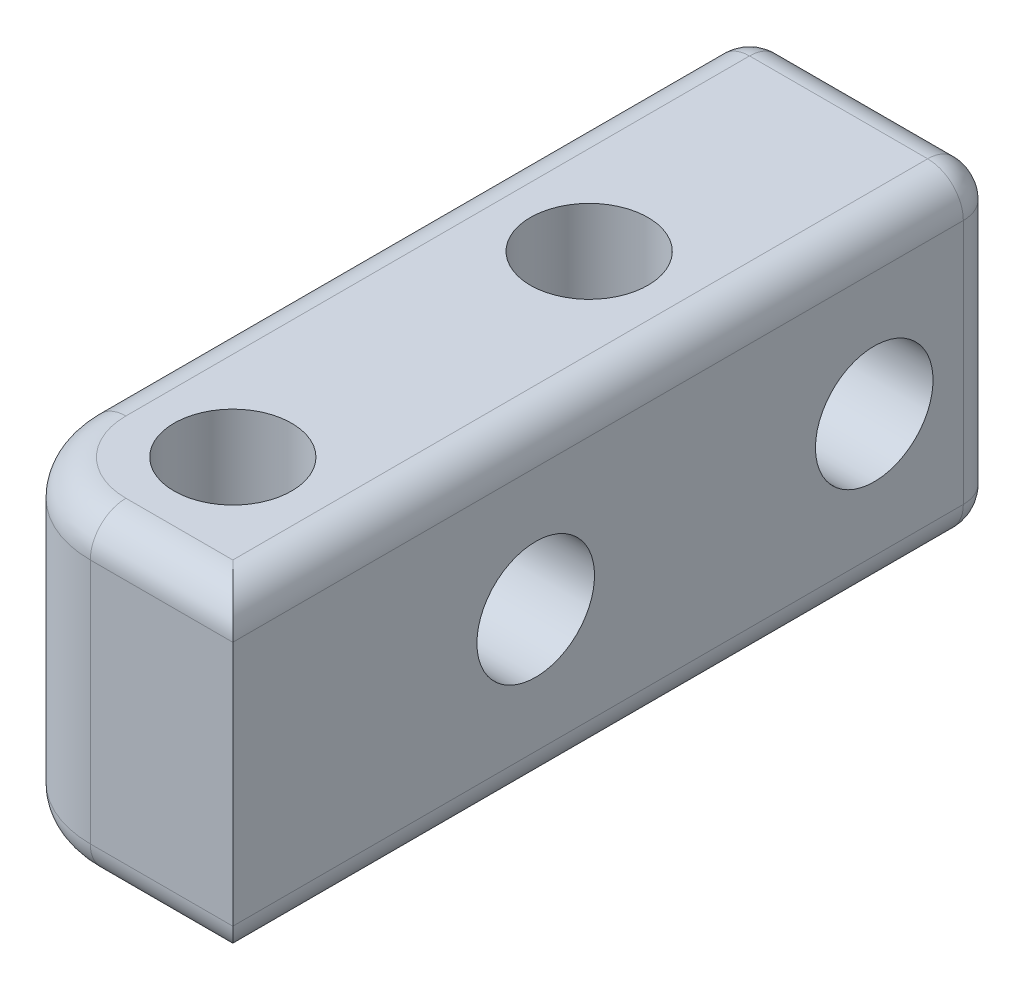
ISO-10303-21;
HEADER;
FILE_DESCRIPTION(('STEP AP214'),'2;1');
FILE_NAME('part.step','',(''),(''),'','','');
FILE_SCHEMA(('AUTOMOTIVE_DESIGN { 1 0 10303 214 1 1 1 1 }'));
ENDSEC;
DATA;
#1=APPLICATION_CONTEXT('core data for automotive mechanical design processes');
#2=APPLICATION_PROTOCOL_DEFINITION('international standard','automotive_design',2000,#1);
#3=PRODUCT_CONTEXT('',#1,'mechanical');
#4=PRODUCT('Part','Part','',(#3));
#5=PRODUCT_RELATED_PRODUCT_CATEGORY('part','',(#4));
#6=PRODUCT_DEFINITION_FORMATION('','',#4);
#7=PRODUCT_DEFINITION_CONTEXT('part definition',#1,'design');
#8=PRODUCT_DEFINITION('design','',#6,#7);
#9=PRODUCT_DEFINITION_SHAPE('','',#8);
#10=(LENGTH_UNIT() NAMED_UNIT(*) SI_UNIT(.MILLI.,.METRE.));
#11=(NAMED_UNIT(*) PLANE_ANGLE_UNIT() SI_UNIT($,.RADIAN.));
#12=(NAMED_UNIT(*) SI_UNIT($,.STERADIAN.) SOLID_ANGLE_UNIT());
#13=UNCERTAINTY_MEASURE_WITH_UNIT(LENGTH_MEASURE(1.E-05),#10,'distance_accuracy_value','');
#14=(GEOMETRIC_REPRESENTATION_CONTEXT(3) GLOBAL_UNCERTAINTY_ASSIGNED_CONTEXT((#13)) GLOBAL_UNIT_ASSIGNED_CONTEXT((#10,
#11,#12)) REPRESENTATION_CONTEXT('',''));
#15=CARTESIAN_POINT('',(0.,0.,0.));
#16=DIRECTION('',(0.,0.,1.));
#17=DIRECTION('',(1.,0.,0.));
#18=AXIS2_PLACEMENT_3D('',#15,#16,#17);
#19=CARTESIAN_POINT('',(0.,8.9,21.5));
#20=DIRECTION('',(0.,-1.,0.));
#21=DIRECTION('',(0.,0.,-1.));
#22=AXIS2_PLACEMENT_3D('',#19,#20,#21);
#23=PLANE('',#22);
#24=CARTESIAN_POINT('',(3.5,8.9,17.9999999999996));
#25=DIRECTION('',(0.,1.,0.));
#26=DIRECTION('',(0.,0.,1.));
#27=AXIS2_PLACEMENT_3D('',#24,#25,#26);
#28=CIRCLE('',#27,1.6499999999996);
#29=CARTESIAN_POINT('',(3.5,8.9,19.6499999999992));
#30=VERTEX_POINT('',#29);
#31=EDGE_CURVE('E258',#30,#30,#28,.T.);
#32=ORIENTED_EDGE('',*,*,#31,.F.);
#33=EDGE_LOOP('',(#32));
#34=FACE_BOUND('',#33,.T.);
#35=CARTESIAN_POINT('',(3.5,8.9,7.99999999999965));
#36=DIRECTION('',(0.,1.,0.));
#37=DIRECTION('',(0.,0.,1.));
#38=AXIS2_PLACEMENT_3D('',#35,#36,#37);
#39=CIRCLE('',#38,1.6499999999996);
#40=CARTESIAN_POINT('',(3.5,8.9,9.64999999999925));
#41=VERTEX_POINT('',#40);
#42=EDGE_CURVE('E263',#41,#41,#39,.T.);
#43=ORIENTED_EDGE('',*,*,#42,.F.);
#44=EDGE_LOOP('',(#43));
#45=FACE_BOUND('',#44,.T.);
#46=CARTESIAN_POINT('',(3.,8.9,18.5));
#47=DIRECTION('',(0.,-1.,0.));
#48=DIRECTION('',(0.,0.,-1.));
#49=AXIS2_PLACEMENT_3D('',#46,#47,#48);
#50=CIRCLE('',#49,2.);
#51=CARTESIAN_POINT('',(3.,8.9,20.5));
#52=VERTEX_POINT('',#51);
#53=CARTESIAN_POINT('',(1.,8.9,18.5));
#54=VERTEX_POINT('',#53);
#55=EDGE_CURVE('E248',#52,#54,#50,.T.);
#56=ORIENTED_EDGE('',*,*,#55,.F.);
#57=DIRECTION('',(-1.,0.,0.));
#58=VECTOR('',#57,1.);
#59=CARTESIAN_POINT('',(0.,8.9,20.5));
#60=LINE('',#59,#58);
#61=CARTESIAN_POINT('',(6.,8.9,20.5));
#62=VERTEX_POINT('',#61);
#63=EDGE_CURVE('E191',#52,#62,#60,.F.);
#64=ORIENTED_EDGE('',*,*,#63,.T.);
#65=DIRECTION('',(0.,0.,-1.));
#66=VECTOR('',#65,1.);
#67=CARTESIAN_POINT('',(6.,8.9,21.5));
#68=LINE('',#67,#66);
#69=CARTESIAN_POINT('',(6.,8.9,1.));
#70=VERTEX_POINT('',#69);
#71=EDGE_CURVE('E138',#62,#70,#68,.T.);
#72=ORIENTED_EDGE('',*,*,#71,.T.);
#73=DIRECTION('',(-1.,0.,0.));
#74=VECTOR('',#73,1.);
#75=CARTESIAN_POINT('',(0.,8.9,1.));
#76=LINE('',#75,#74);
#77=CARTESIAN_POINT('',(1.,8.9,1.));
#78=VERTEX_POINT('',#77);
#79=EDGE_CURVE('E186',#70,#78,#76,.T.);
#80=ORIENTED_EDGE('',*,*,#79,.T.);
#81=DIRECTION('',(0.,0.,-1.));
#82=VECTOR('',#81,1.);
#83=CARTESIAN_POINT('',(1.,8.9,21.5));
#84=LINE('',#83,#82);
#85=EDGE_CURVE('E188',#78,#54,#84,.F.);
#86=ORIENTED_EDGE('',*,*,#85,.T.);
#87=EDGE_LOOP('',(#56,#64,#72,#80,#86));
#88=FACE_BOUND('',#87,.T.);
#89=ADVANCED_FACE('F36',(#34,#45,#88),#23,.F.);
#90=CARTESIAN_POINT('',(0.,0.,21.5));
#91=DIRECTION('',(0.,1.,0.));
#92=DIRECTION('',(0.,0.,1.));
#93=AXIS2_PLACEMENT_3D('',#90,#91,#92);
#94=PLANE('',#93);
#95=CARTESIAN_POINT('',(3.5,0.,17.9999999999996));
#96=DIRECTION('',(0.,1.,0.));
#97=DIRECTION('',(0.,0.,1.));
#98=AXIS2_PLACEMENT_3D('',#95,#96,#97);
#99=CIRCLE('',#98,1.6499999999996);
#100=CARTESIAN_POINT('',(3.5,0.,19.6499999999992));
#101=VERTEX_POINT('',#100);
#102=EDGE_CURVE('E268',#101,#101,#99,.T.);
#103=ORIENTED_EDGE('',*,*,#102,.T.);
#104=EDGE_LOOP('',(#103));
#105=FACE_BOUND('',#104,.T.);
#106=CARTESIAN_POINT('',(3.5,0.,7.99999999999965));
#107=DIRECTION('',(0.,1.,0.));
#108=DIRECTION('',(0.,0.,1.));
#109=AXIS2_PLACEMENT_3D('',#106,#107,#108);
#110=CIRCLE('',#109,1.6499999999996);
#111=CARTESIAN_POINT('',(3.5,0.,9.64999999999925));
#112=VERTEX_POINT('',#111);
#113=EDGE_CURVE('E273',#112,#112,#110,.T.);
#114=ORIENTED_EDGE('',*,*,#113,.T.);
#115=EDGE_LOOP('',(#114));
#116=FACE_BOUND('',#115,.T.);
#117=CARTESIAN_POINT('',(3.,0.,18.5));
#118=DIRECTION('',(0.,1.,0.));
#119=DIRECTION('',(0.,0.,1.));
#120=AXIS2_PLACEMENT_3D('',#117,#118,#119);
#121=CIRCLE('',#120,2.);
#122=CARTESIAN_POINT('',(1.,0.,18.5));
#123=VERTEX_POINT('',#122);
#124=CARTESIAN_POINT('',(3.,0.,20.5));
#125=VERTEX_POINT('',#124);
#126=EDGE_CURVE('E203',#123,#125,#121,.T.);
#127=ORIENTED_EDGE('',*,*,#126,.F.);
#128=DIRECTION('',(0.,0.,-1.));
#129=VECTOR('',#128,1.);
#130=CARTESIAN_POINT('',(1.,0.,21.5));
#131=LINE('',#130,#129);
#132=CARTESIAN_POINT('',(1.,0.,1.));
#133=VERTEX_POINT('',#132);
#134=EDGE_CURVE('E201',#123,#133,#131,.T.);
#135=ORIENTED_EDGE('',*,*,#134,.T.);
#136=DIRECTION('',(1.,0.,0.));
#137=VECTOR('',#136,1.);
#138=CARTESIAN_POINT('',(7.,0.,1.));
#139=LINE('',#138,#137);
#140=CARTESIAN_POINT('',(6.,0.,1.));
#141=VERTEX_POINT('',#140);
#142=EDGE_CURVE('E196',#133,#141,#139,.T.);
#143=ORIENTED_EDGE('',*,*,#142,.T.);
#144=DIRECTION('',(0.,0.,-1.));
#145=VECTOR('',#144,1.);
#146=CARTESIAN_POINT('',(6.,0.,21.5));
#147=LINE('',#146,#145);
#148=CARTESIAN_POINT('',(6.,0.,20.5));
#149=VERTEX_POINT('',#148);
#150=EDGE_CURVE('E198',#141,#149,#147,.F.);
#151=ORIENTED_EDGE('',*,*,#150,.T.);
#152=DIRECTION('',(1.,0.,0.));
#153=VECTOR('',#152,1.);
#154=CARTESIAN_POINT('',(0.,0.,20.5));
#155=LINE('',#154,#153);
#156=EDGE_CURVE('E155',#149,#125,#155,.F.);
#157=ORIENTED_EDGE('',*,*,#156,.T.);
#158=EDGE_LOOP('',(#127,#135,#143,#151,#157));
#159=FACE_BOUND('',#158,.T.);
#160=ADVANCED_FACE('F287',(#105,#116,#159),#94,.F.);
#161=CARTESIAN_POINT('',(0.,0.,21.5));
#162=DIRECTION('',(1.,0.,0.));
#163=DIRECTION('',(0.,0.,-1.));
#164=AXIS2_PLACEMENT_3D('',#161,#162,#163);
#165=PLANE('',#164);
#166=CARTESIAN_POINT('',(0.,4.45,3.5));
#167=DIRECTION('',(-1.,0.,0.));
#168=DIRECTION('',(0.,0.,1.));
#169=AXIS2_PLACEMENT_3D('',#166,#167,#168);
#170=CIRCLE('',#169,1.65);
#171=CARTESIAN_POINT('',(0.,4.45,5.15));
#172=VERTEX_POINT('',#171);
#173=EDGE_CURVE('E239',#172,#172,#170,.T.);
#174=ORIENTED_EDGE('',*,*,#173,.F.);
#175=EDGE_LOOP('',(#174));
#176=FACE_BOUND('',#175,.T.);
#177=CARTESIAN_POINT('',(0.,4.45,13.));
#178=DIRECTION('',(-1.,0.,0.));
#179=DIRECTION('',(0.,0.,1.));
#180=AXIS2_PLACEMENT_3D('',#177,#178,#179);
#181=CIRCLE('',#180,1.65);
#182=CARTESIAN_POINT('',(0.,4.45,14.65));
#183=VERTEX_POINT('',#182);
#184=EDGE_CURVE('E276',#183,#183,#181,.T.);
#185=ORIENTED_EDGE('',*,*,#184,.F.);
#186=EDGE_LOOP('',(#185));
#187=FACE_BOUND('',#186,.T.);
#188=DIRECTION('',(0.,0.,-1.));
#189=VECTOR('',#188,1.);
#190=CARTESIAN_POINT('',(0.,1.,21.5));
#191=LINE('',#190,#189);
#192=CARTESIAN_POINT('',(0.,1.,1.));
#193=VERTEX_POINT('',#192);
#194=CARTESIAN_POINT('',(0.,1.,18.5));
#195=VERTEX_POINT('',#194);
#196=EDGE_CURVE('E180',#193,#195,#191,.F.);
#197=ORIENTED_EDGE('',*,*,#196,.T.);
#198=DIRECTION('',(0.,-1.,0.));
#199=VECTOR('',#198,1.);
#200=CARTESIAN_POINT('',(0.,0.,18.5));
#201=LINE('',#200,#199);
#202=CARTESIAN_POINT('',(0.,7.9,18.5));
#203=VERTEX_POINT('',#202);
#204=EDGE_CURVE('E11',#195,#203,#201,.F.);
#205=ORIENTED_EDGE('',*,*,#204,.T.);
#206=DIRECTION('',(0.,0.,-1.));
#207=VECTOR('',#206,1.);
#208=CARTESIAN_POINT('',(0.,7.9,21.5));
#209=LINE('',#208,#207);
#210=CARTESIAN_POINT('',(0.,7.9,1.));
#211=VERTEX_POINT('',#210);
#212=EDGE_CURVE('E184',#203,#211,#209,.T.);
#213=ORIENTED_EDGE('',*,*,#212,.T.);
#214=DIRECTION('',(0.,-1.,0.));
#215=VECTOR('',#214,1.);
#216=CARTESIAN_POINT('',(0.,0.,1.));
#217=LINE('',#216,#215);
#218=EDGE_CURVE('E182',#211,#193,#217,.T.);
#219=ORIENTED_EDGE('',*,*,#218,.T.);
#220=EDGE_LOOP('',(#197,#205,#213,#219));
#221=FACE_BOUND('',#220,.T.);
#222=ADVANCED_FACE('F284',(#176,#187,#221),#165,.F.);
#223=CARTESIAN_POINT('',(7.,0.,21.5));
#224=DIRECTION('',(-1.,0.,0.));
#225=DIRECTION('',(0.,0.,1.));
#226=AXIS2_PLACEMENT_3D('',#223,#224,#225);
#227=PLANE('',#226);
#228=CARTESIAN_POINT('',(7.,4.45,3.5));
#229=DIRECTION('',(-1.,0.,0.));
#230=DIRECTION('',(0.,0.,1.));
#231=AXIS2_PLACEMENT_3D('',#228,#229,#230);
#232=CIRCLE('',#231,1.65);
#233=CARTESIAN_POINT('',(7.,4.45,5.15));
#234=VERTEX_POINT('',#233);
#235=EDGE_CURVE('E207',#234,#234,#232,.T.);
#236=ORIENTED_EDGE('',*,*,#235,.T.);
#237=EDGE_LOOP('',(#236));
#238=FACE_BOUND('',#237,.T.);
#239=CARTESIAN_POINT('',(7.,4.45,13.));
#240=DIRECTION('',(-1.,0.,0.));
#241=DIRECTION('',(0.,0.,1.));
#242=AXIS2_PLACEMENT_3D('',#239,#240,#241);
#243=CIRCLE('',#242,1.65);
#244=CARTESIAN_POINT('',(7.,4.45,14.65));
#245=VERTEX_POINT('',#244);
#246=EDGE_CURVE('E236',#245,#245,#243,.T.);
#247=ORIENTED_EDGE('',*,*,#246,.T.);
#248=EDGE_LOOP('',(#247));
#249=FACE_BOUND('',#248,.T.);
#250=DIRECTION('',(0.,1.,0.));
#251=VECTOR('',#250,1.);
#252=CARTESIAN_POINT('',(7.,8.9,1.));
#253=LINE('',#252,#251);
#254=CARTESIAN_POINT('',(7.,1.,1.));
#255=VERTEX_POINT('',#254);
#256=CARTESIAN_POINT('',(7.,7.9,1.));
#257=VERTEX_POINT('',#256);
#258=EDGE_CURVE('E165',#255,#257,#253,.T.);
#259=ORIENTED_EDGE('',*,*,#258,.T.);
#260=DIRECTION('',(0.,0.,-1.));
#261=VECTOR('',#260,1.);
#262=CARTESIAN_POINT('',(7.,7.9,21.5));
#263=LINE('',#262,#261);
#264=CARTESIAN_POINT('',(7.,7.9,21.5));
#265=VERTEX_POINT('',#264);
#266=EDGE_CURVE('E147',#257,#265,#263,.F.);
#267=ORIENTED_EDGE('',*,*,#266,.T.);
#268=DIRECTION('',(0.,1.,0.));
#269=VECTOR('',#268,1.);
#270=CARTESIAN_POINT('',(7.,0.,21.5));
#271=LINE('',#270,#269);
#272=CARTESIAN_POINT('',(7.,1.,21.5));
#273=VERTEX_POINT('',#272);
#274=EDGE_CURVE('E132',#273,#265,#271,.T.);
#275=ORIENTED_EDGE('',*,*,#274,.F.);
#276=DIRECTION('',(0.,0.,-1.));
#277=VECTOR('',#276,1.);
#278=CARTESIAN_POINT('',(7.,1.,21.5));
#279=LINE('',#278,#277);
#280=EDGE_CURVE('E144',#273,#255,#279,.T.);
#281=ORIENTED_EDGE('',*,*,#280,.T.);
#282=EDGE_LOOP('',(#259,#267,#275,#281));
#283=FACE_BOUND('',#282,.T.);
#284=ADVANCED_FACE('F142',(#238,#249,#283),#227,.F.);
#285=CARTESIAN_POINT('',(0.,0.,21.5));
#286=DIRECTION('',(0.,0.,-1.));
#287=DIRECTION('',(-1.,0.,0.));
#288=AXIS2_PLACEMENT_3D('',#285,#286,#287);
#289=PLANE('',#288);
#290=DIRECTION('',(-1.,0.,0.));
#291=VECTOR('',#290,1.);
#292=CARTESIAN_POINT('',(0.,7.9,21.5));
#293=LINE('',#292,#291);
#294=CARTESIAN_POINT('',(3.,7.9,21.5));
#295=VERTEX_POINT('',#294);
#296=EDGE_CURVE('E137',#265,#295,#293,.T.);
#297=ORIENTED_EDGE('',*,*,#296,.T.);
#298=DIRECTION('',(0.,-1.,0.));
#299=VECTOR('',#298,1.);
#300=CARTESIAN_POINT('',(3.,0.,21.5));
#301=LINE('',#300,#299);
#302=CARTESIAN_POINT('',(3.,1.,21.5));
#303=VERTEX_POINT('',#302);
#304=EDGE_CURVE('E45',#295,#303,#301,.T.);
#305=ORIENTED_EDGE('',*,*,#304,.T.);
#306=DIRECTION('',(1.,0.,0.));
#307=VECTOR('',#306,1.);
#308=CARTESIAN_POINT('',(0.,1.,21.5));
#309=LINE('',#308,#307);
#310=EDGE_CURVE('E129',#303,#273,#309,.T.);
#311=ORIENTED_EDGE('',*,*,#310,.T.);
#312=ORIENTED_EDGE('',*,*,#274,.T.);
#313=EDGE_LOOP('',(#297,#305,#311,#312));
#314=FACE_BOUND('',#313,.T.);
#315=ADVANCED_FACE('F131',(#314),#289,.F.);
#316=CARTESIAN_POINT('',(0.,0.,0.));
#317=DIRECTION('',(0.,0.,-1.));
#318=DIRECTION('',(-1.,0.,0.));
#319=AXIS2_PLACEMENT_3D('',#316,#317,#318);
#320=PLANE('',#319);
#321=DIRECTION('',(0.,-1.,0.));
#322=VECTOR('',#321,1.);
#323=CARTESIAN_POINT('',(1.,8.9,0.));
#324=LINE('',#323,#322);
#325=CARTESIAN_POINT('',(1.,1.,0.));
#326=VERTEX_POINT('',#325);
#327=CARTESIAN_POINT('',(1.,7.9,0.));
#328=VERTEX_POINT('',#327);
#329=EDGE_CURVE('E173',#326,#328,#324,.F.);
#330=ORIENTED_EDGE('',*,*,#329,.T.);
#331=DIRECTION('',(-1.,0.,0.));
#332=VECTOR('',#331,1.);
#333=CARTESIAN_POINT('',(7.,7.9,0.));
#334=LINE('',#333,#332);
#335=CARTESIAN_POINT('',(6.,7.9,0.));
#336=VERTEX_POINT('',#335);
#337=EDGE_CURVE('E178',#328,#336,#334,.F.);
#338=ORIENTED_EDGE('',*,*,#337,.T.);
#339=DIRECTION('',(0.,1.,0.));
#340=VECTOR('',#339,1.);
#341=CARTESIAN_POINT('',(6.,0.,0.));
#342=LINE('',#341,#340);
#343=CARTESIAN_POINT('',(6.,1.,0.));
#344=VERTEX_POINT('',#343);
#345=EDGE_CURVE('E175',#336,#344,#342,.F.);
#346=ORIENTED_EDGE('',*,*,#345,.T.);
#347=DIRECTION('',(1.,0.,0.));
#348=VECTOR('',#347,1.);
#349=CARTESIAN_POINT('',(0.,1.,0.));
#350=LINE('',#349,#348);
#351=EDGE_CURVE('E171',#344,#326,#350,.F.);
#352=ORIENTED_EDGE('',*,*,#351,.T.);
#353=EDGE_LOOP('',(#330,#338,#346,#352));
#354=FACE_BOUND('',#353,.T.);
#355=ADVANCED_FACE('F342',(#354),#320,.T.);
#356=CARTESIAN_POINT('',(1.,1.,21.5));
#357=DIRECTION('',(0.,0.,-1.));
#358=DIRECTION('',(-1.,0.,0.));
#359=AXIS2_PLACEMENT_3D('',#356,#357,#358);
#360=CYLINDRICAL_SURFACE('',#359,1.);
#361=ORIENTED_EDGE('',*,*,#134,.F.);
#362=CARTESIAN_POINT('',(1.,1.,18.5));
#363=DIRECTION('',(0.,0.,-1.));
#364=DIRECTION('',(-1.,0.,0.));
#365=AXIS2_PLACEMENT_3D('',#362,#363,#364);
#366=CIRCLE('',#365,1.);
#367=EDGE_CURVE('E53',#123,#195,#366,.T.);
#368=ORIENTED_EDGE('',*,*,#367,.T.);
#369=ORIENTED_EDGE('',*,*,#196,.F.);
#370=CARTESIAN_POINT('',(1.,1.,1.));
#371=DIRECTION('',(0.,0.,-1.));
#372=DIRECTION('',(-1.,0.,0.));
#373=AXIS2_PLACEMENT_3D('',#370,#371,#372);
#374=CIRCLE('',#373,1.);
#375=EDGE_CURVE('E231',#133,#193,#374,.T.);
#376=ORIENTED_EDGE('',*,*,#375,.F.);
#377=EDGE_LOOP('',(#361,#368,#369,#376));
#378=FACE_BOUND('',#377,.T.);
#379=ADVANCED_FACE('F340',(#378),#360,.T.);
#380=CARTESIAN_POINT('',(1.,7.9,21.5));
#381=DIRECTION('',(0.,0.,-1.));
#382=DIRECTION('',(-1.,0.,0.));
#383=AXIS2_PLACEMENT_3D('',#380,#381,#382);
#384=CYLINDRICAL_SURFACE('',#383,1.);
#385=ORIENTED_EDGE('',*,*,#212,.F.);
#386=CARTESIAN_POINT('',(1.,7.9,18.5));
#387=DIRECTION('',(0.,0.,-1.));
#388=DIRECTION('',(-1.,0.,0.));
#389=AXIS2_PLACEMENT_3D('',#386,#387,#388);
#390=CIRCLE('',#389,1.);
#391=EDGE_CURVE('E246',#203,#54,#390,.T.);
#392=ORIENTED_EDGE('',*,*,#391,.T.);
#393=ORIENTED_EDGE('',*,*,#85,.F.);
#394=CARTESIAN_POINT('',(1.,7.9,1.));
#395=DIRECTION('',(0.,0.,-1.));
#396=DIRECTION('',(-1.,0.,0.));
#397=AXIS2_PLACEMENT_3D('',#394,#395,#396);
#398=CIRCLE('',#397,1.);
#399=EDGE_CURVE('E228',#211,#78,#398,.T.);
#400=ORIENTED_EDGE('',*,*,#399,.F.);
#401=EDGE_LOOP('',(#385,#392,#393,#400));
#402=FACE_BOUND('',#401,.T.);
#403=ADVANCED_FACE('F325',(#402),#384,.T.);
#404=CARTESIAN_POINT('',(1.,0.,1.));
#405=DIRECTION('',(0.,1.,0.));
#406=DIRECTION('',(0.,0.,1.));
#407=AXIS2_PLACEMENT_3D('',#404,#405,#406);
#408=CYLINDRICAL_SURFACE('',#407,1.);
#409=CARTESIAN_POINT('',(1.,1.,1.));
#410=DIRECTION('',(0.,-1.,0.));
#411=DIRECTION('',(0.,0.,-1.));
#412=AXIS2_PLACEMENT_3D('',#409,#410,#411);
#413=CIRCLE('',#412,1.);
#414=EDGE_CURVE('E148',#193,#326,#413,.T.);
#415=ORIENTED_EDGE('',*,*,#414,.F.);
#416=ORIENTED_EDGE('',*,*,#218,.F.);
#417=CARTESIAN_POINT('',(1.,7.9,1.));
#418=DIRECTION('',(0.,1.,0.));
#419=DIRECTION('',(0.,0.,1.));
#420=AXIS2_PLACEMENT_3D('',#417,#418,#419);
#421=CIRCLE('',#420,1.);
#422=EDGE_CURVE('E225',#328,#211,#421,.T.);
#423=ORIENTED_EDGE('',*,*,#422,.F.);
#424=ORIENTED_EDGE('',*,*,#329,.F.);
#425=EDGE_LOOP('',(#415,#416,#423,#424));
#426=FACE_BOUND('',#425,.T.);
#427=ADVANCED_FACE('F337',(#426),#408,.T.);
#428=CARTESIAN_POINT('',(1.,1.,1.));
#429=DIRECTION('',(0.,0.,1.));
#430=DIRECTION('',(1.,0.,0.));
#431=AXIS2_PLACEMENT_3D('',#428,#429,#430);
#432=SPHERICAL_SURFACE('',#431,1.);
#433=ORIENTED_EDGE('',*,*,#375,.T.);
#434=ORIENTED_EDGE('',*,*,#414,.T.);
#435=CARTESIAN_POINT('',(1.,1.,1.));
#436=DIRECTION('',(-1.,0.,0.));
#437=DIRECTION('',(0.,0.,1.));
#438=AXIS2_PLACEMENT_3D('',#435,#436,#437);
#439=CIRCLE('',#438,1.);
#440=EDGE_CURVE('E158',#133,#326,#439,.F.);
#441=ORIENTED_EDGE('',*,*,#440,.F.);
#442=EDGE_LOOP('',(#433,#434,#441));
#443=FACE_BOUND('',#442,.T.);
#444=ADVANCED_FACE('F339',(#443),#432,.T.);
#445=CARTESIAN_POINT('',(0.,1.,20.5));
#446=DIRECTION('',(1.,0.,0.));
#447=DIRECTION('',(0.,0.,-1.));
#448=AXIS2_PLACEMENT_3D('',#445,#446,#447);
#449=CYLINDRICAL_SURFACE('',#448,1.);
#450=ORIENTED_EDGE('',*,*,#310,.F.);
#451=CARTESIAN_POINT('',(3.,1.,20.5));
#452=DIRECTION('',(1.,0.,0.));
#453=DIRECTION('',(0.,0.,-1.));
#454=AXIS2_PLACEMENT_3D('',#451,#452,#453);
#455=CIRCLE('',#454,1.);
#456=EDGE_CURVE('E244',#303,#125,#455,.T.);
#457=ORIENTED_EDGE('',*,*,#456,.T.);
#458=ORIENTED_EDGE('',*,*,#156,.F.);
#459=CARTESIAN_POINT('',(6.,1.,20.5));
#460=DIRECTION('',(0.707106781186547,0.,-0.707106781186547));
#461=DIRECTION('',(-0.707106781186547,0.,-0.707106781186547));
#462=AXIS2_PLACEMENT_3D('',#459,#460,#461);
#463=ELLIPSE('',#462,1.41421356237309,1.);
#464=EDGE_CURVE('E152',#273,#149,#463,.T.);
#465=ORIENTED_EDGE('',*,*,#464,.F.);
#466=EDGE_LOOP('',(#450,#457,#458,#465));
#467=FACE_BOUND('',#466,.T.);
#468=ADVANCED_FACE('F153',(#467),#449,.T.);
#469=CARTESIAN_POINT('',(0.,7.9,20.5));
#470=DIRECTION('',(-1.,0.,0.));
#471=DIRECTION('',(0.,0.,1.));
#472=AXIS2_PLACEMENT_3D('',#469,#470,#471);
#473=CYLINDRICAL_SURFACE('',#472,1.);
#474=ORIENTED_EDGE('',*,*,#63,.F.);
#475=CARTESIAN_POINT('',(3.,7.9,20.5));
#476=DIRECTION('',(1.,0.,0.));
#477=DIRECTION('',(0.,0.,-1.));
#478=AXIS2_PLACEMENT_3D('',#475,#476,#477);
#479=CIRCLE('',#478,1.);
#480=EDGE_CURVE('E61',#52,#295,#479,.T.);
#481=ORIENTED_EDGE('',*,*,#480,.T.);
#482=ORIENTED_EDGE('',*,*,#296,.F.);
#483=CARTESIAN_POINT('',(6.,7.9,20.5));
#484=DIRECTION('',(-0.707106781186547,0.,0.707106781186547));
#485=DIRECTION('',(-0.707106781186547,0.,-0.707106781186547));
#486=AXIS2_PLACEMENT_3D('',#483,#484,#485);
#487=ELLIPSE('',#486,1.41421356237309,1.);
#488=EDGE_CURVE('E159',#62,#265,#487,.F.);
#489=ORIENTED_EDGE('',*,*,#488,.F.);
#490=EDGE_LOOP('',(#474,#481,#482,#489));
#491=FACE_BOUND('',#490,.T.);
#492=ADVANCED_FACE('F320',(#491),#473,.T.);
#493=CARTESIAN_POINT('',(1.,7.9,1.));
#494=DIRECTION('',(0.,0.,1.));
#495=DIRECTION('',(1.,0.,0.));
#496=AXIS2_PLACEMENT_3D('',#493,#494,#495);
#497=SPHERICAL_SURFACE('',#496,1.);
#498=ORIENTED_EDGE('',*,*,#422,.T.);
#499=ORIENTED_EDGE('',*,*,#399,.T.);
#500=CARTESIAN_POINT('',(1.,7.9,1.));
#501=DIRECTION('',(-1.,0.,0.));
#502=DIRECTION('',(0.,0.,1.));
#503=AXIS2_PLACEMENT_3D('',#500,#501,#502);
#504=CIRCLE('',#503,1.);
#505=EDGE_CURVE('E218',#328,#78,#504,.F.);
#506=ORIENTED_EDGE('',*,*,#505,.F.);
#507=EDGE_LOOP('',(#498,#499,#506));
#508=FACE_BOUND('',#507,.T.);
#509=ADVANCED_FACE('F333',(#508),#497,.T.);
#510=CARTESIAN_POINT('',(0.,1.,1.));
#511=DIRECTION('',(-1.,0.,0.));
#512=DIRECTION('',(0.,0.,1.));
#513=AXIS2_PLACEMENT_3D('',#510,#511,#512);
#514=CYLINDRICAL_SURFACE('',#513,1.);
#515=ORIENTED_EDGE('',*,*,#440,.T.);
#516=ORIENTED_EDGE('',*,*,#351,.F.);
#517=CARTESIAN_POINT('',(6.,1.,1.));
#518=DIRECTION('',(1.,0.,0.));
#519=DIRECTION('',(0.,0.,-1.));
#520=AXIS2_PLACEMENT_3D('',#517,#518,#519);
#521=CIRCLE('',#520,1.);
#522=EDGE_CURVE('E215',#141,#344,#521,.T.);
#523=ORIENTED_EDGE('',*,*,#522,.F.);
#524=ORIENTED_EDGE('',*,*,#142,.F.);
#525=EDGE_LOOP('',(#515,#516,#523,#524));
#526=FACE_BOUND('',#525,.T.);
#527=ADVANCED_FACE('F302',(#526),#514,.T.);
#528=CARTESIAN_POINT('',(6.,1.,21.5));
#529=DIRECTION('',(0.,0.,-1.));
#530=DIRECTION('',(-1.,0.,0.));
#531=AXIS2_PLACEMENT_3D('',#528,#529,#530);
#532=CYLINDRICAL_SURFACE('',#531,1.);
#533=ORIENTED_EDGE('',*,*,#464,.T.);
#534=ORIENTED_EDGE('',*,*,#150,.F.);
#535=CARTESIAN_POINT('',(6.,1.,1.));
#536=DIRECTION('',(0.,0.,-1.));
#537=DIRECTION('',(-1.,0.,0.));
#538=AXIS2_PLACEMENT_3D('',#535,#536,#537);
#539=CIRCLE('',#538,1.);
#540=EDGE_CURVE('E163',#255,#141,#539,.T.);
#541=ORIENTED_EDGE('',*,*,#540,.F.);
#542=ORIENTED_EDGE('',*,*,#280,.F.);
#543=EDGE_LOOP('',(#533,#534,#541,#542));
#544=FACE_BOUND('',#543,.T.);
#545=ADVANCED_FACE('F161',(#544),#532,.T.);
#546=CARTESIAN_POINT('',(6.,7.9,21.5));
#547=DIRECTION('',(0.,0.,-1.));
#548=DIRECTION('',(-1.,0.,0.));
#549=AXIS2_PLACEMENT_3D('',#546,#547,#548);
#550=CYLINDRICAL_SURFACE('',#549,1.);
#551=ORIENTED_EDGE('',*,*,#488,.T.);
#552=ORIENTED_EDGE('',*,*,#266,.F.);
#553=CARTESIAN_POINT('',(6.,7.9,1.));
#554=DIRECTION('',(0.,0.,-1.));
#555=DIRECTION('',(-1.,0.,0.));
#556=AXIS2_PLACEMENT_3D('',#553,#554,#555);
#557=CIRCLE('',#556,1.);
#558=EDGE_CURVE('E211',#70,#257,#557,.T.);
#559=ORIENTED_EDGE('',*,*,#558,.F.);
#560=ORIENTED_EDGE('',*,*,#71,.F.);
#561=EDGE_LOOP('',(#551,#552,#559,#560));
#562=FACE_BOUND('',#561,.T.);
#563=ADVANCED_FACE('F318',(#562),#550,.T.);
#564=CARTESIAN_POINT('',(0.,7.9,1.));
#565=DIRECTION('',(1.,0.,0.));
#566=DIRECTION('',(0.,0.,-1.));
#567=AXIS2_PLACEMENT_3D('',#564,#565,#566);
#568=CYLINDRICAL_SURFACE('',#567,1.);
#569=ORIENTED_EDGE('',*,*,#505,.T.);
#570=ORIENTED_EDGE('',*,*,#79,.F.);
#571=CARTESIAN_POINT('',(6.,7.9,1.));
#572=DIRECTION('',(1.,0.,0.));
#573=DIRECTION('',(0.,0.,-1.));
#574=AXIS2_PLACEMENT_3D('',#571,#572,#573);
#575=CIRCLE('',#574,1.);
#576=EDGE_CURVE('E209',#336,#70,#575,.T.);
#577=ORIENTED_EDGE('',*,*,#576,.F.);
#578=ORIENTED_EDGE('',*,*,#337,.F.);
#579=EDGE_LOOP('',(#569,#570,#577,#578));
#580=FACE_BOUND('',#579,.T.);
#581=ADVANCED_FACE('F329',(#580),#568,.T.);
#582=CARTESIAN_POINT('',(6.,1.,1.));
#583=DIRECTION('',(0.,0.,1.));
#584=DIRECTION('',(1.,0.,0.));
#585=AXIS2_PLACEMENT_3D('',#582,#583,#584);
#586=SPHERICAL_SURFACE('',#585,1.);
#587=ORIENTED_EDGE('',*,*,#540,.T.);
#588=ORIENTED_EDGE('',*,*,#522,.T.);
#589=CARTESIAN_POINT('',(6.,1.,1.));
#590=DIRECTION('',(0.,-1.,0.));
#591=DIRECTION('',(0.,0.,-1.));
#592=AXIS2_PLACEMENT_3D('',#589,#590,#591);
#593=CIRCLE('',#592,1.);
#594=EDGE_CURVE('E206',#255,#344,#593,.F.);
#595=ORIENTED_EDGE('',*,*,#594,.F.);
#596=EDGE_LOOP('',(#587,#588,#595));
#597=FACE_BOUND('',#596,.T.);
#598=ADVANCED_FACE('F305',(#597),#586,.T.);
#599=CARTESIAN_POINT('',(6.,7.9,1.));
#600=DIRECTION('',(0.,0.,1.));
#601=DIRECTION('',(1.,0.,0.));
#602=AXIS2_PLACEMENT_3D('',#599,#600,#601);
#603=SPHERICAL_SURFACE('',#602,1.);
#604=ORIENTED_EDGE('',*,*,#576,.T.);
#605=ORIENTED_EDGE('',*,*,#558,.T.);
#606=CARTESIAN_POINT('',(6.,7.9,1.));
#607=DIRECTION('',(0.,1.,0.));
#608=DIRECTION('',(0.,0.,1.));
#609=AXIS2_PLACEMENT_3D('',#606,#607,#608);
#610=CIRCLE('',#609,1.);
#611=EDGE_CURVE('E204',#336,#257,#610,.F.);
#612=ORIENTED_EDGE('',*,*,#611,.F.);
#613=EDGE_LOOP('',(#604,#605,#612));
#614=FACE_BOUND('',#613,.T.);
#615=ADVANCED_FACE('F313',(#614),#603,.T.);
#616=CARTESIAN_POINT('',(6.,0.,1.));
#617=DIRECTION('',(0.,-1.,0.));
#618=DIRECTION('',(0.,0.,-1.));
#619=AXIS2_PLACEMENT_3D('',#616,#617,#618);
#620=CYLINDRICAL_SURFACE('',#619,1.);
#621=ORIENTED_EDGE('',*,*,#594,.T.);
#622=ORIENTED_EDGE('',*,*,#345,.F.);
#623=ORIENTED_EDGE('',*,*,#611,.T.);
#624=ORIENTED_EDGE('',*,*,#258,.F.);
#625=EDGE_LOOP('',(#621,#622,#623,#624));
#626=FACE_BOUND('',#625,.T.);
#627=ADVANCED_FACE('F309',(#626),#620,.T.);
#628=CARTESIAN_POINT('',(10.,4.45,13.));
#629=DIRECTION('',(-1.,0.,0.));
#630=DIRECTION('',(0.,0.,1.));
#631=AXIS2_PLACEMENT_3D('',#628,#629,#630);
#632=CYLINDRICAL_SURFACE('',#631,1.65);
#633=ORIENTED_EDGE('',*,*,#184,.T.);
#634=EDGE_LOOP('',(#633));
#635=FACE_BOUND('',#634,.T.);
#636=ORIENTED_EDGE('',*,*,#246,.F.);
#637=EDGE_LOOP('',(#636));
#638=FACE_BOUND('',#637,.T.);
#639=ADVANCED_FACE('F281',(#635,#638),#632,.F.);
#640=CARTESIAN_POINT('',(10.,4.45,3.5));
#641=DIRECTION('',(-1.,0.,0.));
#642=DIRECTION('',(0.,0.,1.));
#643=AXIS2_PLACEMENT_3D('',#640,#641,#642);
#644=CYLINDRICAL_SURFACE('',#643,1.65);
#645=ORIENTED_EDGE('',*,*,#173,.T.);
#646=EDGE_LOOP('',(#645));
#647=FACE_BOUND('',#646,.T.);
#648=ORIENTED_EDGE('',*,*,#235,.F.);
#649=EDGE_LOOP('',(#648));
#650=FACE_BOUND('',#649,.T.);
#651=ADVANCED_FACE('F446',(#647,#650),#644,.F.);
#652=CARTESIAN_POINT('',(3.5,-1.1,17.9999999999996));
#653=DIRECTION('',(0.,1.,0.));
#654=DIRECTION('',(0.,0.,1.));
#655=AXIS2_PLACEMENT_3D('',#652,#653,#654);
#656=CYLINDRICAL_SURFACE('',#655,1.6499999999996);
#657=ORIENTED_EDGE('',*,*,#31,.T.);
#658=EDGE_LOOP('',(#657));
#659=FACE_BOUND('',#658,.T.);
#660=ORIENTED_EDGE('',*,*,#102,.F.);
#661=EDGE_LOOP('',(#660));
#662=FACE_BOUND('',#661,.T.);
#663=ADVANCED_FACE('F453',(#659,#662),#656,.F.);
#664=CARTESIAN_POINT('',(3.5,-1.1,7.99999999999965));
#665=DIRECTION('',(0.,1.,0.));
#666=DIRECTION('',(0.,0.,1.));
#667=AXIS2_PLACEMENT_3D('',#664,#665,#666);
#668=CYLINDRICAL_SURFACE('',#667,1.6499999999996);
#669=ORIENTED_EDGE('',*,*,#42,.T.);
#670=EDGE_LOOP('',(#669));
#671=FACE_BOUND('',#670,.T.);
#672=ORIENTED_EDGE('',*,*,#113,.F.);
#673=EDGE_LOOP('',(#672));
#674=FACE_BOUND('',#673,.T.);
#675=ADVANCED_FACE('F461',(#671,#674),#668,.F.);
#676=CARTESIAN_POINT('',(3.,7.9,18.5));
#677=DIRECTION('',(0.,-1.,0.));
#678=DIRECTION('',(0.,0.,-1.));
#679=AXIS2_PLACEMENT_3D('',#676,#677,#678);
#680=TOROIDAL_SURFACE('',#679,2.,1.);
#681=ORIENTED_EDGE('',*,*,#55,.T.);
#682=ORIENTED_EDGE('',*,*,#391,.F.);
#683=CARTESIAN_POINT('',(3.,7.9,18.5));
#684=DIRECTION('',(0.,-1.,0.));
#685=DIRECTION('',(0.,0.,-1.));
#686=AXIS2_PLACEMENT_3D('',#683,#684,#685);
#687=CIRCLE('',#686,3.);
#688=EDGE_CURVE('E40',#295,#203,#687,.T.);
#689=ORIENTED_EDGE('',*,*,#688,.F.);
#690=ORIENTED_EDGE('',*,*,#480,.F.);
#691=EDGE_LOOP('',(#681,#682,#689,#690));
#692=FACE_BOUND('',#691,.T.);
#693=ADVANCED_FACE('F38',(#692),#680,.T.);
#694=CARTESIAN_POINT('',(3.,0.,18.5));
#695=DIRECTION('',(0.,-1.,0.));
#696=DIRECTION('',(0.,0.,-1.));
#697=AXIS2_PLACEMENT_3D('',#694,#695,#696);
#698=CYLINDRICAL_SURFACE('',#697,3.);
#699=ORIENTED_EDGE('',*,*,#688,.T.);
#700=ORIENTED_EDGE('',*,*,#204,.F.);
#701=CARTESIAN_POINT('',(3.,1.,18.5));
#702=DIRECTION('',(0.,1.,0.));
#703=DIRECTION('',(0.,0.,1.));
#704=AXIS2_PLACEMENT_3D('',#701,#702,#703);
#705=CIRCLE('',#704,3.);
#706=EDGE_CURVE('E253',#303,#195,#705,.F.);
#707=ORIENTED_EDGE('',*,*,#706,.F.);
#708=ORIENTED_EDGE('',*,*,#304,.F.);
#709=EDGE_LOOP('',(#699,#700,#707,#708));
#710=FACE_BOUND('',#709,.T.);
#711=ADVANCED_FACE('F294',(#710),#698,.T.);
#712=CARTESIAN_POINT('',(3.,1.,18.5));
#713=DIRECTION('',(0.,1.,0.));
#714=DIRECTION('',(0.,0.,1.));
#715=AXIS2_PLACEMENT_3D('',#712,#713,#714);
#716=TOROIDAL_SURFACE('',#715,2.,1.);
#717=ORIENTED_EDGE('',*,*,#367,.F.);
#718=ORIENTED_EDGE('',*,*,#126,.T.);
#719=ORIENTED_EDGE('',*,*,#456,.F.);
#720=ORIENTED_EDGE('',*,*,#706,.T.);
#721=EDGE_LOOP('',(#717,#718,#719,#720));
#722=FACE_BOUND('',#721,.T.);
#723=ADVANCED_FACE('F295',(#722),#716,.T.);
#724=CLOSED_SHELL('',(#89,#160,#222,#284,#315,#355,#379,#403,#427,#444,#468,#492,#509,#527,#545,
#563,#581,#598,#615,#627,#639,#651,#663,#675,#693,#711,#723));
#725=MANIFOLD_SOLID_BREP('B2',#724);
#726=ADVANCED_BREP_SHAPE_REPRESENTATION('',(#18,#725),#14);
#727=SHAPE_DEFINITION_REPRESENTATION(#9,#726);
ENDSEC;
END-ISO-10303-21;
